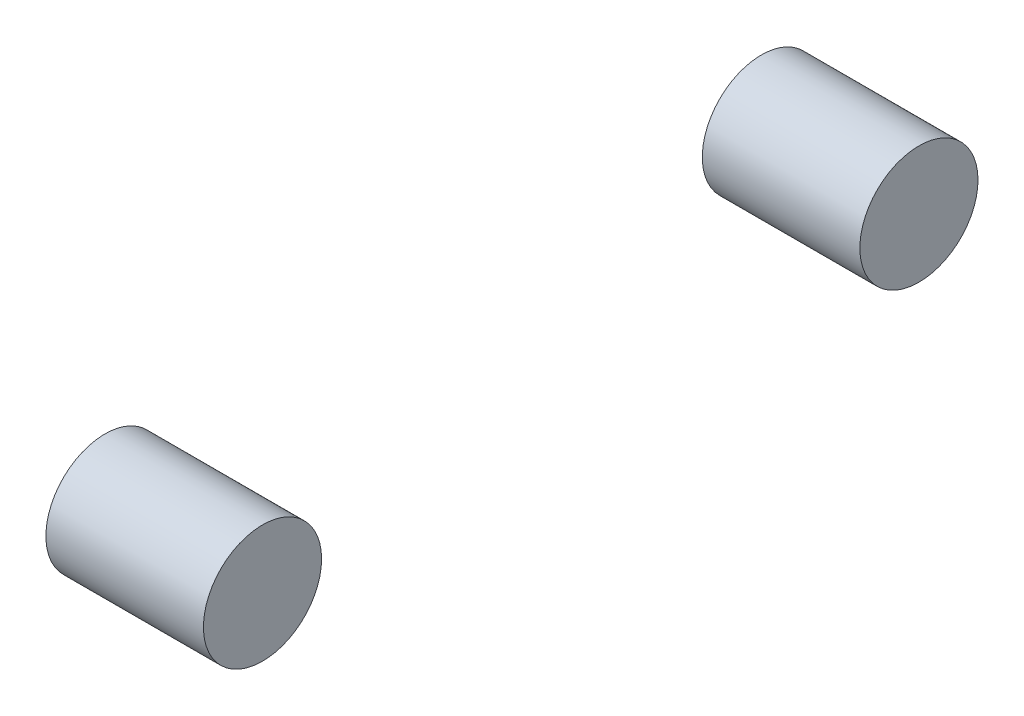
ISO-10303-21;
HEADER;
FILE_DESCRIPTION(('STEP AP214'),'2;1');
FILE_NAME('part.step','',(''),(''),'','','');
FILE_SCHEMA(('AUTOMOTIVE_DESIGN { 1 0 10303 214 1 1 1 1 }'));
ENDSEC;
DATA;
#1=APPLICATION_CONTEXT('core data for automotive mechanical design processes');
#2=APPLICATION_PROTOCOL_DEFINITION('international standard','automotive_design',2000,#1);
#3=PRODUCT_CONTEXT('',#1,'mechanical');
#4=PRODUCT('Part','Part','',(#3));
#5=PRODUCT_RELATED_PRODUCT_CATEGORY('part','',(#4));
#6=PRODUCT_DEFINITION_FORMATION('','',#4);
#7=PRODUCT_DEFINITION_CONTEXT('part definition',#1,'design');
#8=PRODUCT_DEFINITION('design','',#6,#7);
#9=PRODUCT_DEFINITION_SHAPE('','',#8);
#10=(LENGTH_UNIT() NAMED_UNIT(*) SI_UNIT(.MILLI.,.METRE.));
#11=(NAMED_UNIT(*) PLANE_ANGLE_UNIT() SI_UNIT($,.RADIAN.));
#12=(NAMED_UNIT(*) SI_UNIT($,.STERADIAN.) SOLID_ANGLE_UNIT());
#13=UNCERTAINTY_MEASURE_WITH_UNIT(LENGTH_MEASURE(1.E-05),#10,'distance_accuracy_value','');
#14=(GEOMETRIC_REPRESENTATION_CONTEXT(3) GLOBAL_UNCERTAINTY_ASSIGNED_CONTEXT((#13)) GLOBAL_UNIT_ASSIGNED_CONTEXT((#10,
#11,#12)) REPRESENTATION_CONTEXT('',''));
#15=CARTESIAN_POINT('',(0.,0.,0.));
#16=DIRECTION('',(0.,0.,1.));
#17=DIRECTION('',(1.,0.,0.));
#18=AXIS2_PLACEMENT_3D('',#15,#16,#17);
#19=CARTESIAN_POINT('',(-877.712701273992,-1650.,500.));
#20=DIRECTION('',(-1.,0.,0.));
#21=DIRECTION('',(0.,0.,1.));
#22=AXIS2_PLACEMENT_3D('',#19,#20,#21);
#23=CYLINDRICAL_SURFACE('',#22,90.);
#24=CARTESIAN_POINT('',(-877.712701273992,-1650.,500.));
#25=DIRECTION('',(1.,0.,0.));
#26=DIRECTION('',(0.,0.,-1.));
#27=AXIS2_PLACEMENT_3D('',#24,#25,#26);
#28=CIRCLE('',#27,90.);
#29=CARTESIAN_POINT('',(-877.712701273992,-1650.,410.));
#30=VERTEX_POINT('',#29);
#31=EDGE_CURVE('E11',#30,#30,#28,.T.);
#32=ORIENTED_EDGE('',*,*,#31,.F.);
#33=EDGE_LOOP('',(#32));
#34=FACE_BOUND('',#33,.T.);
#35=CARTESIAN_POINT('',(-1117.71270127399,-1650.,500.));
#36=DIRECTION('',(1.,0.,0.));
#37=DIRECTION('',(0.,0.,-1.));
#38=AXIS2_PLACEMENT_3D('',#35,#36,#37);
#39=CIRCLE('',#38,90.);
#40=CARTESIAN_POINT('',(-1117.71270127399,-1650.,410.));
#41=VERTEX_POINT('',#40);
#42=EDGE_CURVE('E48',#41,#41,#39,.T.);
#43=ORIENTED_EDGE('',*,*,#42,.T.);
#44=EDGE_LOOP('',(#43));
#45=FACE_BOUND('',#44,.T.);
#46=ADVANCED_FACE('F44',(#34,#45),#23,.T.);
#47=CARTESIAN_POINT('',(-877.712701273992,-1650.,500.));
#48=DIRECTION('',(1.,0.,0.));
#49=DIRECTION('',(0.,0.,-1.));
#50=AXIS2_PLACEMENT_3D('',#47,#48,#49);
#51=PLANE('',#50);
#52=ORIENTED_EDGE('',*,*,#31,.T.);
#53=EDGE_LOOP('',(#52));
#54=FACE_BOUND('',#53,.T.);
#55=ADVANCED_FACE('F58',(#54),#51,.T.);
#56=CARTESIAN_POINT('',(-1117.71270127399,-1650.,500.));
#57=DIRECTION('',(1.,0.,0.));
#58=DIRECTION('',(0.,0.,-1.));
#59=AXIS2_PLACEMENT_3D('',#56,#57,#58);
#60=PLANE('',#59);
#61=ORIENTED_EDGE('',*,*,#42,.F.);
#62=EDGE_LOOP('',(#61));
#63=FACE_BOUND('',#62,.T.);
#64=ADVANCED_FACE('F59',(#63),#60,.F.);
#65=CLOSED_SHELL('',(#46,#55,#64));
#66=MANIFOLD_SOLID_BREP('B2',#65);
#67=CARTESIAN_POINT('',(-877.712701273992,-1650.,-500.));
#68=DIRECTION('',(-1.,0.,0.));
#69=DIRECTION('',(0.,0.,1.));
#70=AXIS2_PLACEMENT_3D('',#67,#68,#69);
#71=CYLINDRICAL_SURFACE('',#70,90.);
#72=CARTESIAN_POINT('',(-877.712701273992,-1650.,-500.));
#73=DIRECTION('',(1.,0.,0.));
#74=DIRECTION('',(0.,0.,-1.));
#75=AXIS2_PLACEMENT_3D('',#72,#73,#74);
#76=CIRCLE('',#75,90.);
#77=CARTESIAN_POINT('',(-877.712701273992,-1650.,-590.));
#78=VERTEX_POINT('',#77);
#79=EDGE_CURVE('E42',#78,#78,#76,.T.);
#80=ORIENTED_EDGE('',*,*,#79,.F.);
#81=EDGE_LOOP('',(#80));
#82=FACE_BOUND('',#81,.T.);
#83=CARTESIAN_POINT('',(-1117.71270127399,-1650.,-500.));
#84=DIRECTION('',(1.,0.,0.));
#85=DIRECTION('',(0.,0.,-1.));
#86=AXIS2_PLACEMENT_3D('',#83,#84,#85);
#87=CIRCLE('',#86,90.);
#88=CARTESIAN_POINT('',(-1117.71270127399,-1650.,-590.));
#89=VERTEX_POINT('',#88);
#90=EDGE_CURVE('E90',#89,#89,#87,.T.);
#91=ORIENTED_EDGE('',*,*,#90,.T.);
#92=EDGE_LOOP('',(#91));
#93=FACE_BOUND('',#92,.T.);
#94=ADVANCED_FACE('F88',(#82,#93),#71,.T.);
#95=CARTESIAN_POINT('',(-877.712701273992,-1650.,-500.));
#96=DIRECTION('',(1.,0.,0.));
#97=DIRECTION('',(0.,0.,-1.));
#98=AXIS2_PLACEMENT_3D('',#95,#96,#97);
#99=PLANE('',#98);
#100=ORIENTED_EDGE('',*,*,#79,.T.);
#101=EDGE_LOOP('',(#100));
#102=FACE_BOUND('',#101,.T.);
#103=ADVANCED_FACE('F101',(#102),#99,.T.);
#104=CARTESIAN_POINT('',(-1117.71270127399,-1650.,-500.));
#105=DIRECTION('',(1.,0.,0.));
#106=DIRECTION('',(0.,0.,-1.));
#107=AXIS2_PLACEMENT_3D('',#104,#105,#106);
#108=PLANE('',#107);
#109=ORIENTED_EDGE('',*,*,#90,.F.);
#110=EDGE_LOOP('',(#109));
#111=FACE_BOUND('',#110,.T.);
#112=ADVANCED_FACE('F97',(#111),#108,.F.);
#113=CLOSED_SHELL('',(#94,#103,#112));
#114=MANIFOLD_SOLID_BREP('B6',#113);
#115=ADVANCED_BREP_SHAPE_REPRESENTATION('',(#18,#66,#114),#14);
#116=SHAPE_DEFINITION_REPRESENTATION(#9,#115);
ENDSEC;
END-ISO-10303-21;
